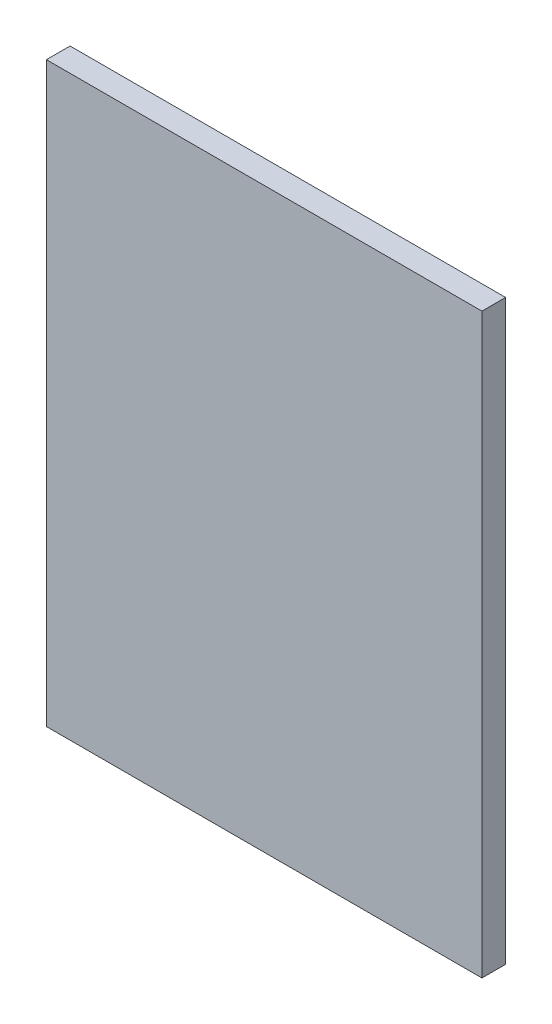
ISO-10303-21;
HEADER;
FILE_DESCRIPTION(('STEP AP214'),'2;1');
FILE_NAME('part.step','',(''),(''),'','','');
FILE_SCHEMA(('AUTOMOTIVE_DESIGN { 1 0 10303 214 1 1 1 1 }'));
ENDSEC;
DATA;
#1=APPLICATION_CONTEXT('core data for automotive mechanical design processes');
#2=APPLICATION_PROTOCOL_DEFINITION('international standard','automotive_design',2000,#1);
#3=PRODUCT_CONTEXT('',#1,'mechanical');
#4=PRODUCT('Part','Part','',(#3));
#5=PRODUCT_RELATED_PRODUCT_CATEGORY('part','',(#4));
#6=PRODUCT_DEFINITION_FORMATION('','',#4);
#7=PRODUCT_DEFINITION_CONTEXT('part definition',#1,'design');
#8=PRODUCT_DEFINITION('design','',#6,#7);
#9=PRODUCT_DEFINITION_SHAPE('','',#8);
#10=(LENGTH_UNIT() NAMED_UNIT(*) SI_UNIT(.MILLI.,.METRE.));
#11=(NAMED_UNIT(*) PLANE_ANGLE_UNIT() SI_UNIT($,.RADIAN.));
#12=(NAMED_UNIT(*) SI_UNIT($,.STERADIAN.) SOLID_ANGLE_UNIT());
#13=UNCERTAINTY_MEASURE_WITH_UNIT(LENGTH_MEASURE(1.E-05),#10,'distance_accuracy_value','');
#14=(GEOMETRIC_REPRESENTATION_CONTEXT(3) GLOBAL_UNCERTAINTY_ASSIGNED_CONTEXT((#13)) GLOBAL_UNIT_ASSIGNED_CONTEXT((#10,
#11,#12)) REPRESENTATION_CONTEXT('',''));
#15=CARTESIAN_POINT('',(0.,0.,0.));
#16=DIRECTION('',(0.,0.,1.));
#17=DIRECTION('',(1.,0.,0.));
#18=AXIS2_PLACEMENT_3D('',#15,#16,#17);
#19=CARTESIAN_POINT('',(261.863857374392,-510.,-37.5));
#20=DIRECTION('',(-1.,0.,0.));
#21=DIRECTION('',(0.,0.,1.));
#22=AXIS2_PLACEMENT_3D('',#19,#20,#21);
#23=CYLINDRICAL_SURFACE('',#22,10.);
#24=CARTESIAN_POINT('',(161.863857374392,-510.,-37.5));
#25=DIRECTION('',(1.,0.,0.));
#26=DIRECTION('',(0.,0.,-1.));
#27=AXIS2_PLACEMENT_3D('',#24,#25,#26);
#28=CIRCLE('',#27,10.);
#29=CARTESIAN_POINT('',(161.863857374392,-510.,-47.5));
#30=VERTEX_POINT('',#29);
#31=EDGE_CURVE('E68',#30,#30,#28,.T.);
#32=ORIENTED_EDGE('',*,*,#31,.T.);
#33=EDGE_LOOP('',(#32));
#34=FACE_BOUND('',#33,.T.);
#35=CARTESIAN_POINT('',(211.863857374392,-510.,-37.5));
#36=DIRECTION('',(1.,0.,0.));
#37=DIRECTION('',(0.,0.,-1.));
#38=AXIS2_PLACEMENT_3D('',#35,#36,#37);
#39=CIRCLE('',#38,10.);
#40=CARTESIAN_POINT('',(211.863857374392,-510.,-47.5));
#41=VERTEX_POINT('',#40);
#42=EDGE_CURVE('E12',#41,#41,#39,.T.);
#43=ORIENTED_EDGE('',*,*,#42,.F.);
#44=EDGE_LOOP('',(#43));
#45=FACE_BOUND('',#44,.T.);
#46=ADVANCED_FACE('F60',(#34,#45),#23,.T.);
#47=CARTESIAN_POINT('',(161.863857374392,-510.,-37.5));
#48=DIRECTION('',(-1.,0.,0.));
#49=DIRECTION('',(0.,0.,1.));
#50=AXIS2_PLACEMENT_3D('',#47,#48,#49);
#51=CYLINDRICAL_SURFACE('',#50,37.5);
#52=CARTESIAN_POINT('',(161.863857374392,-510.,-37.5));
#53=DIRECTION('',(-1.,0.,0.));
#54=DIRECTION('',(0.,0.,1.));
#55=AXIS2_PLACEMENT_3D('',#52,#53,#54);
#56=CIRCLE('',#55,37.5);
#57=CARTESIAN_POINT('',(161.863857374392,-510.,0.));
#58=VERTEX_POINT('',#57);
#59=EDGE_CURVE('E72',#58,#58,#56,.T.);
#60=ORIENTED_EDGE('',*,*,#59,.T.);
#61=EDGE_LOOP('',(#60));
#62=FACE_BOUND('',#61,.T.);
#63=CARTESIAN_POINT('',(61.8638573743923,-510.,-37.5));
#64=DIRECTION('',(-1.,0.,0.));
#65=DIRECTION('',(0.,0.,1.));
#66=AXIS2_PLACEMENT_3D('',#63,#64,#65);
#67=CIRCLE('',#66,37.5);
#68=CARTESIAN_POINT('',(61.8638573743923,-510.,0.));
#69=VERTEX_POINT('',#68);
#70=EDGE_CURVE('E75',#69,#69,#67,.T.);
#71=ORIENTED_EDGE('',*,*,#70,.F.);
#72=EDGE_LOOP('',(#71));
#73=FACE_BOUND('',#72,.T.);
#74=ADVANCED_FACE('F62',(#62,#73),#51,.T.);
#75=CARTESIAN_POINT('',(161.863857374392,-510.,-37.5));
#76=DIRECTION('',(-1.,0.,0.));
#77=DIRECTION('',(0.,0.,1.));
#78=AXIS2_PLACEMENT_3D('',#75,#76,#77);
#79=PLANE('',#78);
#80=ORIENTED_EDGE('',*,*,#31,.F.);
#81=EDGE_LOOP('',(#80));
#82=FACE_BOUND('',#81,.T.);
#83=ORIENTED_EDGE('',*,*,#59,.F.);
#84=EDGE_LOOP('',(#83));
#85=FACE_BOUND('',#84,.T.);
#86=ADVANCED_FACE('F116',(#82,#85),#79,.F.);
#87=CARTESIAN_POINT('',(61.8638573743923,-510.,-37.5));
#88=DIRECTION('',(-1.,0.,0.));
#89=DIRECTION('',(0.,0.,1.));
#90=AXIS2_PLACEMENT_3D('',#87,#88,#89);
#91=PLANE('',#90);
#92=ORIENTED_EDGE('',*,*,#70,.T.);
#93=EDGE_LOOP('',(#92));
#94=FACE_BOUND('',#93,.T.);
#95=ADVANCED_FACE('F107',(#94),#91,.T.);
#96=CARTESIAN_POINT('',(241.863857374392,-510.,-37.5));
#97=DIRECTION('',(-1.,0.,0.));
#98=DIRECTION('',(0.,0.,1.));
#99=AXIS2_PLACEMENT_3D('',#96,#97,#98);
#100=CYLINDRICAL_SURFACE('',#99,22.1394246371702);
#101=CARTESIAN_POINT('',(241.863857374392,-510.,-37.5));
#102=DIRECTION('',(1.,0.,0.));
#103=DIRECTION('',(0.,0.,-1.));
#104=AXIS2_PLACEMENT_3D('',#101,#102,#103);
#105=CIRCLE('',#104,22.1394246371702);
#106=CARTESIAN_POINT('',(241.863857374392,-510.,-59.6394246371702));
#107=VERTEX_POINT('',#106);
#108=EDGE_CURVE('E86',#107,#107,#105,.T.);
#109=ORIENTED_EDGE('',*,*,#108,.F.);
#110=EDGE_LOOP('',(#109));
#111=FACE_BOUND('',#110,.T.);
#112=CARTESIAN_POINT('',(211.863857374392,-510.,-37.5));
#113=DIRECTION('',(1.,0.,0.));
#114=DIRECTION('',(0.,0.,-1.));
#115=AXIS2_PLACEMENT_3D('',#112,#113,#114);
#116=CIRCLE('',#115,22.1394246371702);
#117=CARTESIAN_POINT('',(211.863857374392,-510.,-59.6394246371702));
#118=VERTEX_POINT('',#117);
#119=EDGE_CURVE('E83',#118,#118,#116,.T.);
#120=ORIENTED_EDGE('',*,*,#119,.T.);
#121=EDGE_LOOP('',(#120));
#122=FACE_BOUND('',#121,.T.);
#123=ADVANCED_FACE('F99',(#111,#122),#100,.T.);
#124=CARTESIAN_POINT('',(241.863857374392,-510.,-37.5));
#125=DIRECTION('',(1.,0.,0.));
#126=DIRECTION('',(0.,0.,-1.));
#127=AXIS2_PLACEMENT_3D('',#124,#125,#126);
#128=PLANE('',#127);
#129=CARTESIAN_POINT('',(241.863857374392,-510.,-37.5));
#130=DIRECTION('',(1.,0.,0.));
#131=DIRECTION('',(0.,0.,-1.));
#132=AXIS2_PLACEMENT_3D('',#129,#130,#131);
#133=CIRCLE('',#132,10.);
#134=CARTESIAN_POINT('',(241.863857374392,-510.,-47.5));
#135=VERTEX_POINT('',#134);
#136=EDGE_CURVE('E64',#135,#135,#133,.T.);
#137=ORIENTED_EDGE('',*,*,#136,.F.);
#138=EDGE_LOOP('',(#137));
#139=FACE_BOUND('',#138,.T.);
#140=ORIENTED_EDGE('',*,*,#108,.T.);
#141=EDGE_LOOP('',(#140));
#142=FACE_BOUND('',#141,.T.);
#143=ADVANCED_FACE('F96',(#139,#142),#128,.T.);
#144=CARTESIAN_POINT('',(211.863857374392,-510.,-37.5));
#145=DIRECTION('',(1.,0.,0.));
#146=DIRECTION('',(0.,0.,-1.));
#147=AXIS2_PLACEMENT_3D('',#144,#145,#146);
#148=PLANE('',#147);
#149=ORIENTED_EDGE('',*,*,#42,.T.);
#150=EDGE_LOOP('',(#149));
#151=FACE_BOUND('',#150,.T.);
#152=ORIENTED_EDGE('',*,*,#119,.F.);
#153=EDGE_LOOP('',(#152));
#154=FACE_BOUND('',#153,.T.);
#155=ADVANCED_FACE('F98',(#151,#154),#148,.F.);
#156=CARTESIAN_POINT('',(261.863857374392,-510.,-37.5));
#157=DIRECTION('',(1.,0.,0.));
#158=DIRECTION('',(0.,0.,-1.));
#159=AXIS2_PLACEMENT_3D('',#156,#157,#158);
#160=PLANE('',#159);
#161=CARTESIAN_POINT('',(261.863857374392,-510.,-37.5));
#162=DIRECTION('',(1.,0.,0.));
#163=DIRECTION('',(0.,0.,-1.));
#164=AXIS2_PLACEMENT_3D('',#161,#162,#163);
#165=CIRCLE('',#164,10.);
#166=CARTESIAN_POINT('',(261.863857374392,-510.,-47.5));
#167=VERTEX_POINT('',#166);
#168=EDGE_CURVE('E78',#167,#167,#165,.T.);
#169=ORIENTED_EDGE('',*,*,#168,.T.);
#170=EDGE_LOOP('',(#169));
#171=FACE_BOUND('',#170,.T.);
#172=ADVANCED_FACE('F105',(#171),#160,.T.);
#173=ORIENTED_EDGE('',*,*,#136,.T.);
#174=EDGE_LOOP('',(#173));
#175=FACE_BOUND('',#174,.T.);
#176=ORIENTED_EDGE('',*,*,#168,.F.);
#177=EDGE_LOOP('',(#176));
#178=FACE_BOUND('',#177,.T.);
#179=ADVANCED_FACE('F93',(#175,#178),#23,.T.);
#180=CLOSED_SHELL('',(#46,#74,#86,#95,#123,#143,#155,#172,#179));
#181=MANIFOLD_SOLID_BREP('B2',#180);
#182=CARTESIAN_POINT('',(11.8638573743923,0.,25.));
#183=DIRECTION('',(1.,0.,0.));
#184=DIRECTION('',(0.,0.,-1.));
#185=AXIS2_PLACEMENT_3D('',#182,#183,#184);
#186=PLANE('',#185);
#187=DIRECTION('',(0.,-1.,0.));
#188=VECTOR('',#187,1.);
#189=CARTESIAN_POINT('',(11.8638573743923,0.,0.));
#190=LINE('',#189,#188);
#191=CARTESIAN_POINT('',(11.8638573743923,0.,0.));
#192=VERTEX_POINT('',#191);
#193=CARTESIAN_POINT('',(11.8638573743923,-610.,0.));
#194=VERTEX_POINT('',#193);
#195=EDGE_CURVE('E279',#192,#194,#190,.T.);
#196=ORIENTED_EDGE('',*,*,#195,.T.);
#197=DIRECTION('',(0.,0.,-1.));
#198=VECTOR('',#197,1.);
#199=CARTESIAN_POINT('',(11.8638573743923,-610.,25.));
#200=LINE('',#199,#198);
#201=CARTESIAN_POINT('',(11.8638573743923,-610.,25.));
#202=VERTEX_POINT('',#201);
#203=EDGE_CURVE('E329',#202,#194,#200,.T.);
#204=ORIENTED_EDGE('',*,*,#203,.F.);
#205=DIRECTION('',(0.,-1.,0.));
#206=VECTOR('',#205,1.);
#207=CARTESIAN_POINT('',(11.8638573743923,0.,25.));
#208=LINE('',#207,#206);
#209=CARTESIAN_POINT('',(11.8638573743923,0.,25.));
#210=VERTEX_POINT('',#209);
#211=EDGE_CURVE('E303',#210,#202,#208,.T.);
#212=ORIENTED_EDGE('',*,*,#211,.F.);
#213=DIRECTION('',(0.,0.,-1.));
#214=VECTOR('',#213,1.);
#215=CARTESIAN_POINT('',(11.8638573743923,0.,25.));
#216=LINE('',#215,#214);
#217=EDGE_CURVE('E313',#210,#192,#216,.T.);
#218=ORIENTED_EDGE('',*,*,#217,.T.);
#219=EDGE_LOOP('',(#196,#204,#212,#218));
#220=FACE_BOUND('',#219,.T.);
#221=ADVANCED_FACE('F189',(#220),#186,.F.);
#222=CARTESIAN_POINT('',(11.8638573743923,-610.,25.));
#223=DIRECTION('',(0.,1.,0.));
#224=DIRECTION('',(0.,0.,1.));
#225=AXIS2_PLACEMENT_3D('',#222,#223,#224);
#226=PLANE('',#225);
#227=DIRECTION('',(1.,0.,0.));
#228=VECTOR('',#227,1.);
#229=CARTESIAN_POINT('',(11.8638573743923,-610.,0.));
#230=LINE('',#229,#228);
#231=CARTESIAN_POINT('',(471.863857374392,-610.,0.));
#232=VERTEX_POINT('',#231);
#233=EDGE_CURVE('E316',#194,#232,#230,.T.);
#234=ORIENTED_EDGE('',*,*,#233,.T.);
#235=DIRECTION('',(0.,0.,-1.));
#236=VECTOR('',#235,1.);
#237=CARTESIAN_POINT('',(471.863857374392,-610.,25.));
#238=LINE('',#237,#236);
#239=CARTESIAN_POINT('',(471.863857374392,-610.,25.));
#240=VERTEX_POINT('',#239);
#241=EDGE_CURVE('E326',#240,#232,#238,.T.);
#242=ORIENTED_EDGE('',*,*,#241,.F.);
#243=DIRECTION('',(1.,0.,0.));
#244=VECTOR('',#243,1.);
#245=CARTESIAN_POINT('',(11.8638573743923,-610.,25.));
#246=LINE('',#245,#244);
#247=EDGE_CURVE('E306',#202,#240,#246,.T.);
#248=ORIENTED_EDGE('',*,*,#247,.F.);
#249=ORIENTED_EDGE('',*,*,#203,.T.);
#250=EDGE_LOOP('',(#234,#242,#248,#249));
#251=FACE_BOUND('',#250,.T.);
#252=ADVANCED_FACE('F376',(#251),#226,.F.);
#253=CARTESIAN_POINT('',(471.863857374392,0.,25.));
#254=DIRECTION('',(-1.,0.,0.));
#255=DIRECTION('',(0.,-1.,0.));
#256=AXIS2_PLACEMENT_3D('',#253,#254,#255);
#257=PLANE('',#256);
#258=DIRECTION('',(0.,1.,0.));
#259=VECTOR('',#258,1.);
#260=CARTESIAN_POINT('',(471.863857374392,0.,0.));
#261=LINE('',#260,#259);
#262=CARTESIAN_POINT('',(471.863857374392,0.,0.));
#263=VERTEX_POINT('',#262);
#264=EDGE_CURVE('E318',#232,#263,#261,.T.);
#265=ORIENTED_EDGE('',*,*,#264,.T.);
#266=DIRECTION('',(0.,0.,-1.));
#267=VECTOR('',#266,1.);
#268=CARTESIAN_POINT('',(471.863857374392,0.,25.));
#269=LINE('',#268,#267);
#270=CARTESIAN_POINT('',(471.863857374392,0.,25.));
#271=VERTEX_POINT('',#270);
#272=EDGE_CURVE('E323',#271,#263,#269,.T.);
#273=ORIENTED_EDGE('',*,*,#272,.F.);
#274=DIRECTION('',(0.,1.,0.));
#275=VECTOR('',#274,1.);
#276=CARTESIAN_POINT('',(471.863857374392,0.,25.));
#277=LINE('',#276,#275);
#278=EDGE_CURVE('E309',#240,#271,#277,.T.);
#279=ORIENTED_EDGE('',*,*,#278,.F.);
#280=ORIENTED_EDGE('',*,*,#241,.T.);
#281=EDGE_LOOP('',(#265,#273,#279,#280));
#282=FACE_BOUND('',#281,.T.);
#283=ADVANCED_FACE('F382',(#282),#257,.F.);
#284=CARTESIAN_POINT('',(11.8638573743923,0.,25.));
#285=DIRECTION('',(0.,-1.,0.));
#286=DIRECTION('',(0.,0.,-1.));
#287=AXIS2_PLACEMENT_3D('',#284,#285,#286);
#288=PLANE('',#287);
#289=DIRECTION('',(-1.,0.,0.));
#290=VECTOR('',#289,1.);
#291=CARTESIAN_POINT('',(11.8638573743923,0.,0.));
#292=LINE('',#291,#290);
#293=EDGE_CURVE('E307',#263,#192,#292,.T.);
#294=ORIENTED_EDGE('',*,*,#293,.T.);
#295=ORIENTED_EDGE('',*,*,#217,.F.);
#296=DIRECTION('',(-1.,0.,0.));
#297=VECTOR('',#296,1.);
#298=CARTESIAN_POINT('',(11.8638573743923,0.,25.));
#299=LINE('',#298,#297);
#300=EDGE_CURVE('E311',#271,#210,#299,.T.);
#301=ORIENTED_EDGE('',*,*,#300,.F.);
#302=ORIENTED_EDGE('',*,*,#272,.T.);
#303=EDGE_LOOP('',(#294,#295,#301,#302));
#304=FACE_BOUND('',#303,.T.);
#305=ADVANCED_FACE('F406',(#304),#288,.F.);
#306=CARTESIAN_POINT('',(0.,0.,25.));
#307=DIRECTION('',(0.,0.,1.));
#308=DIRECTION('',(1.,0.,0.));
#309=AXIS2_PLACEMENT_3D('',#306,#307,#308);
#310=PLANE('',#309);
#311=ORIENTED_EDGE('',*,*,#211,.T.);
#312=ORIENTED_EDGE('',*,*,#247,.T.);
#313=ORIENTED_EDGE('',*,*,#278,.T.);
#314=ORIENTED_EDGE('',*,*,#300,.T.);
#315=EDGE_LOOP('',(#311,#312,#313,#314));
#316=FACE_BOUND('',#315,.T.);
#317=ADVANCED_FACE('F403',(#316),#310,.T.);
#318=CARTESIAN_POINT('',(0.,0.,0.));
#319=DIRECTION('',(0.,0.,1.));
#320=DIRECTION('',(1.,0.,0.));
#321=AXIS2_PLACEMENT_3D('',#318,#319,#320);
#322=PLANE('',#321);
#323=DIRECTION('',(-1.,0.,0.));
#324=VECTOR('',#323,1.);
#325=CARTESIAN_POINT('',(261.863857374392,-175.,0.));
#326=LINE('',#325,#324);
#327=CARTESIAN_POINT('',(261.863857374392,-175.,0.));
#328=VERTEX_POINT('',#327);
#329=CARTESIAN_POINT('',(211.863857374392,-175.,0.));
#330=VERTEX_POINT('',#329);
#331=EDGE_CURVE('E280',#328,#330,#326,.T.);
#332=ORIENTED_EDGE('',*,*,#331,.F.);
#333=DIRECTION('',(0.,1.,0.));
#334=VECTOR('',#333,1.);
#335=CARTESIAN_POINT('',(261.863857374392,-175.,0.));
#336=LINE('',#335,#334);
#337=CARTESIAN_POINT('',(261.863857374392,-100.,0.));
#338=VERTEX_POINT('',#337);
#339=EDGE_CURVE('E275',#328,#338,#336,.T.);
#340=ORIENTED_EDGE('',*,*,#339,.T.);
#341=DIRECTION('',(-1.,0.,0.));
#342=VECTOR('',#341,1.);
#343=CARTESIAN_POINT('',(261.863857374392,-100.,0.));
#344=LINE('',#343,#342);
#345=CARTESIAN_POINT('',(211.863857374392,-100.,0.));
#346=VERTEX_POINT('',#345);
#347=EDGE_CURVE('E267',#338,#346,#344,.T.);
#348=ORIENTED_EDGE('',*,*,#347,.T.);
#349=DIRECTION('',(0.,1.,0.));
#350=VECTOR('',#349,1.);
#351=CARTESIAN_POINT('',(211.863857374392,-175.,0.));
#352=LINE('',#351,#350);
#353=EDGE_CURVE('E272',#330,#346,#352,.T.);
#354=ORIENTED_EDGE('',*,*,#353,.F.);
#355=EDGE_LOOP('',(#332,#340,#348,#354));
#356=FACE_BOUND('',#355,.T.);
#357=ORIENTED_EDGE('',*,*,#195,.F.);
#358=ORIENTED_EDGE('',*,*,#293,.F.);
#359=ORIENTED_EDGE('',*,*,#264,.F.);
#360=ORIENTED_EDGE('',*,*,#233,.F.);
#361=EDGE_LOOP('',(#357,#358,#359,#360));
#362=FACE_BOUND('',#361,.T.);
#363=ADVANCED_FACE('F269',(#356,#362),#322,.F.);
#364=CARTESIAN_POINT('',(261.863857374392,-100.,0.));
#365=DIRECTION('',(0.,1.,0.));
#366=DIRECTION('',(0.,0.,1.));
#367=AXIS2_PLACEMENT_3D('',#364,#365,#366);
#368=PLANE('',#367);
#369=DIRECTION('',(0.,0.,-1.));
#370=VECTOR('',#369,1.);
#371=CARTESIAN_POINT('',(261.863857374392,-100.,0.));
#372=LINE('',#371,#370);
#373=CARTESIAN_POINT('',(261.863857374392,-100.,-55.));
#374=VERTEX_POINT('',#373);
#375=EDGE_CURVE('E295',#338,#374,#372,.T.);
#376=ORIENTED_EDGE('',*,*,#375,.T.);
#377=DIRECTION('',(-1.,0.,0.));
#378=VECTOR('',#377,1.);
#379=CARTESIAN_POINT('',(211.863857374392,-100.,-55.));
#380=LINE('',#379,#378);
#381=CARTESIAN_POINT('',(211.863857374392,-100.,-55.));
#382=VERTEX_POINT('',#381);
#383=EDGE_CURVE('E287',#374,#382,#380,.T.);
#384=ORIENTED_EDGE('',*,*,#383,.T.);
#385=DIRECTION('',(0.,0.,-1.));
#386=VECTOR('',#385,1.);
#387=CARTESIAN_POINT('',(211.863857374392,-100.,0.));
#388=LINE('',#387,#386);
#389=EDGE_CURVE('E284',#346,#382,#388,.T.);
#390=ORIENTED_EDGE('',*,*,#389,.F.);
#391=ORIENTED_EDGE('',*,*,#347,.F.);
#392=EDGE_LOOP('',(#376,#384,#390,#391));
#393=FACE_BOUND('',#392,.T.);
#394=ADVANCED_FACE('F285',(#393),#368,.T.);
#395=CARTESIAN_POINT('',(261.863857374392,-175.,0.));
#396=DIRECTION('',(0.,1.,0.));
#397=DIRECTION('',(0.,0.,1.));
#398=AXIS2_PLACEMENT_3D('',#395,#396,#397);
#399=PLANE('',#398);
#400=DIRECTION('',(0.,0.,-1.));
#401=VECTOR('',#400,1.);
#402=CARTESIAN_POINT('',(211.863857374392,-175.,0.));
#403=LINE('',#402,#401);
#404=CARTESIAN_POINT('',(211.863857374392,-175.,-55.));
#405=VERTEX_POINT('',#404);
#406=EDGE_CURVE('E294',#330,#405,#403,.T.);
#407=ORIENTED_EDGE('',*,*,#406,.T.);
#408=DIRECTION('',(-1.,0.,0.));
#409=VECTOR('',#408,1.);
#410=CARTESIAN_POINT('',(261.863857374392,-175.,-55.));
#411=LINE('',#410,#409);
#412=CARTESIAN_POINT('',(261.863857374392,-175.,-55.));
#413=VERTEX_POINT('',#412);
#414=EDGE_CURVE('E58',#405,#413,#411,.F.);
#415=ORIENTED_EDGE('',*,*,#414,.T.);
#416=DIRECTION('',(0.,0.,-1.));
#417=VECTOR('',#416,1.);
#418=CARTESIAN_POINT('',(261.863857374392,-175.,0.));
#419=LINE('',#418,#417);
#420=EDGE_CURVE('E352',#328,#413,#419,.T.);
#421=ORIENTED_EDGE('',*,*,#420,.F.);
#422=ORIENTED_EDGE('',*,*,#331,.T.);
#423=EDGE_LOOP('',(#407,#415,#421,#422));
#424=FACE_BOUND('',#423,.T.);
#425=ADVANCED_FACE('F394',(#424),#399,.F.);
#426=CARTESIAN_POINT('',(261.863857374392,-175.,-75.));
#427=DIRECTION('',(0.,0.,1.));
#428=DIRECTION('',(1.,0.,0.));
#429=AXIS2_PLACEMENT_3D('',#426,#427,#428);
#430=PLANE('',#429);
#431=DIRECTION('',(0.,1.,0.));
#432=VECTOR('',#431,1.);
#433=CARTESIAN_POINT('',(211.863857374392,-175.,-75.));
#434=LINE('',#433,#432);
#435=CARTESIAN_POINT('',(211.863857374392,-155.,-75.));
#436=VERTEX_POINT('',#435);
#437=CARTESIAN_POINT('',(211.863857374392,-120.,-75.));
#438=VERTEX_POINT('',#437);
#439=EDGE_CURVE('E289',#436,#438,#434,.T.);
#440=ORIENTED_EDGE('',*,*,#439,.T.);
#441=DIRECTION('',(-1.,0.,0.));
#442=VECTOR('',#441,1.);
#443=CARTESIAN_POINT('',(261.863857374392,-120.,-75.));
#444=LINE('',#443,#442);
#445=CARTESIAN_POINT('',(261.863857374392,-120.,-75.));
#446=VERTEX_POINT('',#445);
#447=EDGE_CURVE('E210',#438,#446,#444,.F.);
#448=ORIENTED_EDGE('',*,*,#447,.T.);
#449=DIRECTION('',(0.,1.,0.));
#450=VECTOR('',#449,1.);
#451=CARTESIAN_POINT('',(261.863857374392,-175.,-75.));
#452=LINE('',#451,#450);
#453=CARTESIAN_POINT('',(261.863857374392,-155.,-75.));
#454=VERTEX_POINT('',#453);
#455=EDGE_CURVE('E297',#454,#446,#452,.T.);
#456=ORIENTED_EDGE('',*,*,#455,.F.);
#457=DIRECTION('',(-1.,0.,0.));
#458=VECTOR('',#457,1.);
#459=CARTESIAN_POINT('',(261.863857374392,-155.,-75.));
#460=LINE('',#459,#458);
#461=EDGE_CURVE('E337',#454,#436,#460,.T.);
#462=ORIENTED_EDGE('',*,*,#461,.T.);
#463=EDGE_LOOP('',(#440,#448,#456,#462));
#464=FACE_BOUND('',#463,.T.);
#465=ADVANCED_FACE('F348',(#464),#430,.F.);
#466=CARTESIAN_POINT('',(261.863857374392,0.,0.));
#467=DIRECTION('',(1.,0.,0.));
#468=DIRECTION('',(0.,0.,-1.));
#469=AXIS2_PLACEMENT_3D('',#466,#467,#468);
#470=PLANE('',#469);
#471=CARTESIAN_POINT('',(261.863857374392,-137.5,-37.5));
#472=DIRECTION('',(-1.,0.,0.));
#473=DIRECTION('',(0.,0.,1.));
#474=AXIS2_PLACEMENT_3D('',#471,#472,#473);
#475=CIRCLE('',#474,15.);
#476=CARTESIAN_POINT('',(261.863857374392,-137.5,-22.5));
#477=VERTEX_POINT('',#476);
#478=EDGE_CURVE('E290',#477,#477,#475,.T.);
#479=ORIENTED_EDGE('',*,*,#478,.T.);
#480=EDGE_LOOP('',(#479));
#481=FACE_BOUND('',#480,.T.);
#482=ORIENTED_EDGE('',*,*,#455,.T.);
#483=CARTESIAN_POINT('',(261.863857374392,-120.,-55.));
#484=DIRECTION('',(1.,0.,0.));
#485=DIRECTION('',(0.,0.,-1.));
#486=AXIS2_PLACEMENT_3D('',#483,#484,#485);
#487=CIRCLE('',#486,20.);
#488=EDGE_CURVE('E197',#446,#374,#487,.T.);
#489=ORIENTED_EDGE('',*,*,#488,.T.);
#490=ORIENTED_EDGE('',*,*,#375,.F.);
#491=ORIENTED_EDGE('',*,*,#339,.F.);
#492=ORIENTED_EDGE('',*,*,#420,.T.);
#493=CARTESIAN_POINT('',(261.863857374392,-155.,-55.));
#494=DIRECTION('',(1.,0.,0.));
#495=DIRECTION('',(0.,0.,-1.));
#496=AXIS2_PLACEMENT_3D('',#493,#494,#495);
#497=CIRCLE('',#496,20.);
#498=EDGE_CURVE('E341',#413,#454,#497,.T.);
#499=ORIENTED_EDGE('',*,*,#498,.T.);
#500=EDGE_LOOP('',(#482,#489,#490,#491,#492,#499));
#501=FACE_BOUND('',#500,.T.);
#502=ADVANCED_FACE('F344',(#481,#501),#470,.T.);
#503=CARTESIAN_POINT('',(211.863857374392,0.,0.));
#504=DIRECTION('',(1.,0.,0.));
#505=DIRECTION('',(0.,0.,-1.));
#506=AXIS2_PLACEMENT_3D('',#503,#504,#505);
#507=PLANE('',#506);
#508=CARTESIAN_POINT('',(211.863857374392,-137.5,-37.5));
#509=DIRECTION('',(-1.,0.,0.));
#510=DIRECTION('',(0.,0.,1.));
#511=AXIS2_PLACEMENT_3D('',#508,#509,#510);
#512=CIRCLE('',#511,15.);
#513=CARTESIAN_POINT('',(211.863857374392,-137.5,-22.5));
#514=VERTEX_POINT('',#513);
#515=EDGE_CURVE('E355',#514,#514,#512,.T.);
#516=ORIENTED_EDGE('',*,*,#515,.F.);
#517=EDGE_LOOP('',(#516));
#518=FACE_BOUND('',#517,.T.);
#519=ORIENTED_EDGE('',*,*,#389,.T.);
#520=CARTESIAN_POINT('',(211.863857374392,-120.,-55.));
#521=DIRECTION('',(1.,0.,0.));
#522=DIRECTION('',(0.,0.,-1.));
#523=AXIS2_PLACEMENT_3D('',#520,#521,#522);
#524=CIRCLE('',#523,20.);
#525=EDGE_CURVE('E335',#382,#438,#524,.F.);
#526=ORIENTED_EDGE('',*,*,#525,.T.);
#527=ORIENTED_EDGE('',*,*,#439,.F.);
#528=CARTESIAN_POINT('',(211.863857374392,-155.,-55.));
#529=DIRECTION('',(1.,0.,0.));
#530=DIRECTION('',(0.,0.,-1.));
#531=AXIS2_PLACEMENT_3D('',#528,#529,#530);
#532=CIRCLE('',#531,20.);
#533=EDGE_CURVE('E333',#436,#405,#532,.F.);
#534=ORIENTED_EDGE('',*,*,#533,.T.);
#535=ORIENTED_EDGE('',*,*,#406,.F.);
#536=ORIENTED_EDGE('',*,*,#353,.T.);
#537=EDGE_LOOP('',(#519,#526,#527,#534,#535,#536));
#538=FACE_BOUND('',#537,.T.);
#539=ADVANCED_FACE('F293',(#518,#538),#507,.F.);
#540=CARTESIAN_POINT('',(261.863857374392,-137.5,-37.5));
#541=DIRECTION('',(-1.,0.,0.));
#542=DIRECTION('',(0.,0.,1.));
#543=AXIS2_PLACEMENT_3D('',#540,#541,#542);
#544=CYLINDRICAL_SURFACE('',#543,15.);
#545=ORIENTED_EDGE('',*,*,#478,.F.);
#546=EDGE_LOOP('',(#545));
#547=FACE_BOUND('',#546,.T.);
#548=ORIENTED_EDGE('',*,*,#515,.T.);
#549=EDGE_LOOP('',(#548));
#550=FACE_BOUND('',#549,.T.);
#551=ADVANCED_FACE('F362',(#547,#550),#544,.F.);
#552=CARTESIAN_POINT('',(261.863857374392,-120.,-55.));
#553=DIRECTION('',(1.,0.,0.));
#554=DIRECTION('',(0.,0.,-1.));
#555=AXIS2_PLACEMENT_3D('',#552,#553,#554);
#556=CYLINDRICAL_SURFACE('',#555,20.);
#557=ORIENTED_EDGE('',*,*,#488,.F.);
#558=ORIENTED_EDGE('',*,*,#447,.F.);
#559=ORIENTED_EDGE('',*,*,#525,.F.);
#560=ORIENTED_EDGE('',*,*,#383,.F.);
#561=EDGE_LOOP('',(#557,#558,#559,#560));
#562=FACE_BOUND('',#561,.T.);
#563=ADVANCED_FACE('F346',(#562),#556,.T.);
#564=CARTESIAN_POINT('',(261.863857374392,-155.,-55.));
#565=DIRECTION('',(-1.,0.,0.));
#566=DIRECTION('',(0.,0.,1.));
#567=AXIS2_PLACEMENT_3D('',#564,#565,#566);
#568=CYLINDRICAL_SURFACE('',#567,20.);
#569=ORIENTED_EDGE('',*,*,#498,.F.);
#570=ORIENTED_EDGE('',*,*,#414,.F.);
#571=ORIENTED_EDGE('',*,*,#533,.F.);
#572=ORIENTED_EDGE('',*,*,#461,.F.);
#573=EDGE_LOOP('',(#569,#570,#571,#572));
#574=FACE_BOUND('',#573,.T.);
#575=ADVANCED_FACE('F191',(#574),#568,.T.);
#576=CLOSED_SHELL('',(#221,#252,#283,#305,#317,#363,#394,#425,#465,#502,#539,#551,#563,#575));
#577=MANIFOLD_SOLID_BREP('B7',#576);
#578=ADVANCED_BREP_SHAPE_REPRESENTATION('',(#18,#181,#577),#14);
#579=SHAPE_DEFINITION_REPRESENTATION(#9,#578);
ENDSEC;
END-ISO-10303-21;
